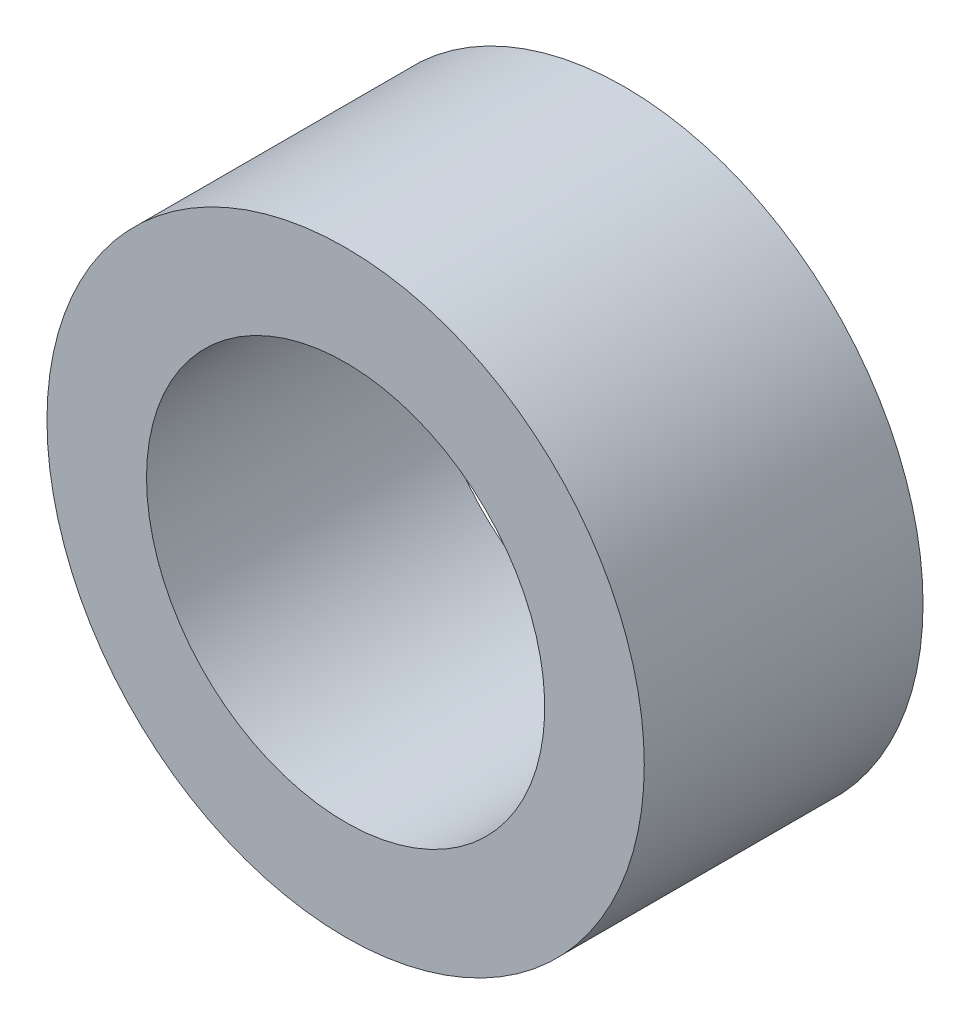
ISO-10303-21;
HEADER;
FILE_DESCRIPTION(('STEP AP214'),'2;1');
FILE_NAME('part.step','',(''),(''),'','','');
FILE_SCHEMA(('AUTOMOTIVE_DESIGN { 1 0 10303 214 1 1 1 1 }'));
ENDSEC;
DATA;
#1=APPLICATION_CONTEXT('core data for automotive mechanical design processes');
#2=APPLICATION_PROTOCOL_DEFINITION('international standard','automotive_design',2000,#1);
#3=PRODUCT_CONTEXT('',#1,'mechanical');
#4=PRODUCT('Part','Part','',(#3));
#5=PRODUCT_RELATED_PRODUCT_CATEGORY('part','',(#4));
#6=PRODUCT_DEFINITION_FORMATION('','',#4);
#7=PRODUCT_DEFINITION_CONTEXT('part definition',#1,'design');
#8=PRODUCT_DEFINITION('design','',#6,#7);
#9=PRODUCT_DEFINITION_SHAPE('','',#8);
#10=(LENGTH_UNIT() NAMED_UNIT(*) SI_UNIT(.MILLI.,.METRE.));
#11=(NAMED_UNIT(*) PLANE_ANGLE_UNIT() SI_UNIT($,.RADIAN.));
#12=(NAMED_UNIT(*) SI_UNIT($,.STERADIAN.) SOLID_ANGLE_UNIT());
#13=UNCERTAINTY_MEASURE_WITH_UNIT(LENGTH_MEASURE(1.E-05),#10,'distance_accuracy_value','');
#14=(GEOMETRIC_REPRESENTATION_CONTEXT(3) GLOBAL_UNCERTAINTY_ASSIGNED_CONTEXT((#13)) GLOBAL_UNIT_ASSIGNED_CONTEXT((#10,
#11,#12)) REPRESENTATION_CONTEXT('',''));
#15=CARTESIAN_POINT('',(0.,0.,0.));
#16=DIRECTION('',(0.,0.,1.));
#17=DIRECTION('',(1.,0.,0.));
#18=AXIS2_PLACEMENT_3D('',#15,#16,#17);
#19=CARTESIAN_POINT('',(2.4980018054066E-13,3.99680288865056E-12,13.9999999999989));
#20=DIRECTION('',(0.,0.,0.999999999999998));
#21=DIRECTION('',(1.,0.,0.));
#22=AXIS2_PLACEMENT_3D('',#19,#20,#21);
#23=PLANE('',#22);
#24=CARTESIAN_POINT('',(2.4980018054066E-13,3.99680288865056E-12,13.9999999999989));
#25=DIRECTION('',(0.,0.,0.999999999999998));
#26=DIRECTION('',(1.,0.,0.));
#27=AXIS2_PLACEMENT_3D('',#24,#25,#26);
#28=CIRCLE('',#27,30.);
#29=CARTESIAN_POINT('',(-29.9999999999997,3.94309584983432E-12,13.9999999999989));
#30=VERTEX_POINT('',#29);
#31=EDGE_CURVE('E12',#30,#30,#28,.T.);
#32=ORIENTED_EDGE('',*,*,#31,.T.);
#33=EDGE_LOOP('',(#32));
#34=FACE_BOUND('',#33,.T.);
#35=CARTESIAN_POINT('',(2.4980018054066E-13,3.99680288865056E-12,13.9999999999989));
#36=DIRECTION('',(0.,0.,0.999999999999998));
#37=DIRECTION('',(1.,0.,0.));
#38=AXIS2_PLACEMENT_3D('',#35,#36,#37);
#39=CIRCLE('',#38,20.);
#40=CARTESIAN_POINT('',(-19.9999999999998,3.9609981961064E-12,13.9999999999989));
#41=VERTEX_POINT('',#40);
#42=EDGE_CURVE('E56',#41,#41,#39,.T.);
#43=ORIENTED_EDGE('',*,*,#42,.F.);
#44=EDGE_LOOP('',(#43));
#45=FACE_BOUND('',#44,.T.);
#46=ADVANCED_FACE('F42',(#34,#45),#23,.T.);
#47=CARTESIAN_POINT('',(2.77555756156289E-13,2.66453525910038E-12,-14.0000000000002));
#48=DIRECTION('',(0.,0.,0.999999999999998));
#49=DIRECTION('',(1.,0.,0.));
#50=AXIS2_PLACEMENT_3D('',#47,#48,#49);
#51=PLANE('',#50);
#52=CARTESIAN_POINT('',(2.77555756156289E-13,2.66453525910038E-12,-14.0000000000002));
#53=DIRECTION('',(0.,0.,0.999999999999998));
#54=DIRECTION('',(1.,0.,0.));
#55=AXIS2_PLACEMENT_3D('',#52,#53,#54);
#56=CIRCLE('',#55,30.);
#57=CARTESIAN_POINT('',(-29.9999999999997,3.94960453231619E-12,-14.0000000000002));
#58=VERTEX_POINT('',#57);
#59=EDGE_CURVE('E46',#58,#58,#56,.T.);
#60=ORIENTED_EDGE('',*,*,#59,.F.);
#61=EDGE_LOOP('',(#60));
#62=FACE_BOUND('',#61,.T.);
#63=CARTESIAN_POINT('',(2.77555756156289E-13,2.66453525910038E-12,-14.0000000000002));
#64=DIRECTION('',(0.,0.,0.999999999999998));
#65=DIRECTION('',(1.,0.,0.));
#66=AXIS2_PLACEMENT_3D('',#63,#64,#65);
#67=CIRCLE('',#66,20.);
#68=CARTESIAN_POINT('',(-19.9999999999998,3.96750687858827E-12,-14.0000000000002));
#69=VERTEX_POINT('',#68);
#70=EDGE_CURVE('E58',#69,#69,#67,.T.);
#71=ORIENTED_EDGE('',*,*,#70,.T.);
#72=EDGE_LOOP('',(#71));
#73=FACE_BOUND('',#72,.T.);
#74=ADVANCED_FACE('F71',(#62,#73),#51,.F.);
#75=CARTESIAN_POINT('',(2.4980018054066E-13,3.99680288865056E-12,13.9999999999989));
#76=DIRECTION('',(0.,0.,-0.999999999999998));
#77=DIRECTION('',(-1.,0.,0.));
#78=AXIS2_PLACEMENT_3D('',#75,#76,#77);
#79=CYLINDRICAL_SURFACE('',#78,30.);
#80=CARTESIAN_POINT('',(-29.9999999999997,3.94309584983432E-12,13.9999999999989));
#81=CARTESIAN_POINT('',(-29.9999999999997,3.94316364861017E-12,13.7083333333322));
#82=CARTESIAN_POINT('',(-29.9999999999997,3.94323144738603E-12,13.4166666666656));
#83=CARTESIAN_POINT('',(-29.9999999999997,3.94336704493773E-12,12.8333333333323));
#84=CARTESIAN_POINT('',(-29.9999999999997,3.94343484371359E-12,12.5416666666656));
#85=CARTESIAN_POINT('',(-29.9999999999997,3.94357044126529E-12,11.9583333333323));
#86=CARTESIAN_POINT('',(-29.9999999999997,3.94363824004114E-12,11.6666666666656));
#87=CARTESIAN_POINT('',(-29.9999999999997,3.94377383759285E-12,11.0833333333323));
#88=CARTESIAN_POINT('',(-29.9999999999997,3.9438416363687E-12,10.7916666666657));
#89=CARTESIAN_POINT('',(-29.9999999999997,3.94397723392041E-12,10.2083333333324));
#90=CARTESIAN_POINT('',(-29.9999999999997,3.94404503269626E-12,9.91666666666569));
#91=CARTESIAN_POINT('',(-29.9999999999997,3.94418063024797E-12,9.33333333333238));
#92=CARTESIAN_POINT('',(-29.9999999999997,3.94424842902382E-12,9.04166666666572));
#93=CARTESIAN_POINT('',(-29.9999999999997,3.94438402657552E-12,8.4583333333324));
#94=CARTESIAN_POINT('',(-29.9999999999997,3.94445182535138E-12,8.16666666666575));
#95=CARTESIAN_POINT('',(-29.9999999999997,3.94458742290308E-12,7.58333333333243));
#96=CARTESIAN_POINT('',(-29.9999999999997,3.94465522167894E-12,7.29166666666577));
#97=CARTESIAN_POINT('',(-29.9999999999997,3.94479081923064E-12,6.70833333333246));
#98=CARTESIAN_POINT('',(-29.9999999999997,3.94485861800649E-12,6.4166666666658));
#99=CARTESIAN_POINT('',(-29.9999999999997,3.9449942155582E-12,5.83333333333249));
#100=CARTESIAN_POINT('',(-29.9999999999997,3.94506201433405E-12,5.54166666666583));
#101=CARTESIAN_POINT('',(-29.9999999999997,3.94519761188576E-12,4.95833333333251));
#102=CARTESIAN_POINT('',(-29.9999999999997,3.94526541066161E-12,4.66666666666586));
#103=CARTESIAN_POINT('',(-29.9999999999997,3.94540100821331E-12,4.08333333333254));
#104=CARTESIAN_POINT('',(-29.9999999999997,3.94546880698917E-12,3.79166666666588));
#105=CARTESIAN_POINT('',(-29.9999999999997,3.94560440454087E-12,3.20833333333257));
#106=CARTESIAN_POINT('',(-29.9999999999997,3.94567220331673E-12,2.91666666666591));
#107=CARTESIAN_POINT('',(-29.9999999999997,3.94580780086843E-12,2.33333333333259));
#108=CARTESIAN_POINT('',(-29.9999999999997,3.94587559964428E-12,2.04166666666593));
#109=CARTESIAN_POINT('',(-29.9999999999997,3.94601119719599E-12,1.45833333333262));
#110=CARTESIAN_POINT('',(-29.9999999999997,3.94607899597184E-12,1.16666666666596));
#111=CARTESIAN_POINT('',(-29.9999999999997,3.94621459352355E-12,0.583333333332647));
#112=CARTESIAN_POINT('',(-29.9999999999997,3.9462823922994E-12,0.29166666666599));
#113=CARTESIAN_POINT('',(-29.9999999999997,3.94641798985111E-12,-0.291666666667325));
#114=CARTESIAN_POINT('',(-29.9999999999997,3.94648578862696E-12,-0.583333333333983));
#115=CARTESIAN_POINT('',(-29.9999999999997,3.94662138617866E-12,-1.1666666666673));
#116=CARTESIAN_POINT('',(-29.9999999999997,3.94668918495452E-12,-1.45833333333396));
#117=CARTESIAN_POINT('',(-29.9999999999997,3.94682478250622E-12,-2.04166666666727));
#118=CARTESIAN_POINT('',(-29.9999999999997,3.94689258128208E-12,-2.33333333333393));
#119=CARTESIAN_POINT('',(-29.9999999999997,3.94702817883378E-12,-2.91666666666724));
#120=CARTESIAN_POINT('',(-29.9999999999997,3.94709597760963E-12,-3.2083333333339));
#121=CARTESIAN_POINT('',(-29.9999999999997,3.94723157516134E-12,-3.79166666666722));
#122=CARTESIAN_POINT('',(-29.9999999999997,3.94729937393719E-12,-4.08333333333387));
#123=CARTESIAN_POINT('',(-29.9999999999997,3.9474349714889E-12,-4.66666666666719));
#124=CARTESIAN_POINT('',(-29.9999999999997,3.94750277026475E-12,-4.95833333333385));
#125=CARTESIAN_POINT('',(-29.9999999999997,3.94763836781646E-12,-5.54166666666716));
#126=CARTESIAN_POINT('',(-29.9999999999997,3.94770616659231E-12,-5.83333333333382));
#127=CARTESIAN_POINT('',(-29.9999999999997,3.94784176414402E-12,-6.41666666666714));
#128=CARTESIAN_POINT('',(-29.9999999999997,3.94790956291987E-12,-6.70833333333379));
#129=CARTESIAN_POINT('',(-29.9999999999997,3.94804516047157E-12,-7.29166666666711));
#130=CARTESIAN_POINT('',(-29.9999999999997,3.94811295924743E-12,-7.58333333333377));
#131=CARTESIAN_POINT('',(-29.9999999999997,3.94824855679913E-12,-8.16666666666708));
#132=CARTESIAN_POINT('',(-29.9999999999997,3.94831635557498E-12,-8.45833333333374));
#133=CARTESIAN_POINT('',(-29.9999999999997,3.94845195312669E-12,-9.04166666666706));
#134=CARTESIAN_POINT('',(-29.9999999999997,3.94851975190254E-12,-9.33333333333371));
#135=CARTESIAN_POINT('',(-29.9999999999997,3.94865534945425E-12,-9.91666666666703));
#136=CARTESIAN_POINT('',(-29.9999999999997,3.9487231482301E-12,-10.2083333333337));
#137=CARTESIAN_POINT('',(-29.9999999999997,3.94885874578181E-12,-10.791666666667));
#138=CARTESIAN_POINT('',(-29.9999999999997,3.94892654455766E-12,-11.0833333333337));
#139=CARTESIAN_POINT('',(-29.9999999999997,3.94906214210936E-12,-11.666666666667));
#140=CARTESIAN_POINT('',(-29.9999999999997,3.94912994088522E-12,-11.9583333333336));
#141=CARTESIAN_POINT('',(-29.9999999999997,3.94926553843692E-12,-12.5416666666669));
#142=CARTESIAN_POINT('',(-29.9999999999997,3.94933333721278E-12,-12.8333333333336));
#143=CARTESIAN_POINT('',(-29.9999999999997,3.94946893476448E-12,-13.4166666666669));
#144=CARTESIAN_POINT('',(-29.9999999999997,3.94953673354033E-12,-13.7083333333336));
#145=CARTESIAN_POINT('',(-29.9999999999997,3.94960453231619E-12,-14.0000000000002));
#146=B_SPLINE_CURVE_WITH_KNOTS('',3,(#80,#81,#82,#83,#84,#85,#86,#87,#88,#89,#90,#91,#92,#93,
#94,#95,#96,#97,#98,#99,#100,#101,#102,#103,#104,#105,#106,#107,#108,#109,#110,#111,#112,#113,
#114,#115,#116,#117,#118,#119,#120,#121,#122,#123,#124,#125,#126,#127,#128,#129,#130,#131,#132,
#133,#134,#135,#136,#137,#138,#139,#140,#141,#142,#143,#144,#145),.UNSPECIFIED.,.F.,.F.,(4,2,2,
2,2,2,2,2,2,2,2,2,2,2,2,2,2,2,2,2,2,2,2,2,2,2,2,2,2,2,2,2,4),(0.,0.874999999999971,
1.74999999999994,2.62499999999992,3.49999999999989,4.37499999999986,5.24999999999984,
6.12499999999981,6.99999999999978,7.87499999999976,8.74999999999973,9.6249999999997,
10.4999999999997,11.3749999999997,12.2499999999996,13.1249999999996,13.9999999999996,
14.8749999999995,15.7499999999995,16.6249999999995,17.4999999999995,18.3749999999994,
19.2499999999994,20.1249999999994,20.9999999999994,21.8749999999993,22.7499999999993,
23.6249999999993,24.4999999999992,25.3749999999992,26.2499999999992,27.1249999999992,
27.9999999999991),.UNSPECIFIED.);
#147=EDGE_CURVE('BSEAM44',#30,#58,#146,.T.);
#148=ORIENTED_EDGE('',*,*,#31,.F.);
#149=ORIENTED_EDGE('',*,*,#59,.T.);
#150=ORIENTED_EDGE('',*,*,#147,.T.);
#151=ORIENTED_EDGE('',*,*,#147,.F.);
#152=EDGE_LOOP('',(#148,#150,#149,#151));
#153=FACE_BOUND('',#152,.T.);
#154=ADVANCED_FACE('F44',(#153),#79,.T.);
#155=CARTESIAN_POINT('',(2.4980018054066E-13,3.99680288865056E-12,13.9999999999989));
#156=DIRECTION('',(0.,0.,-0.999999999999998));
#157=DIRECTION('',(-1.,0.,0.));
#158=AXIS2_PLACEMENT_3D('',#155,#156,#157);
#159=CYLINDRICAL_SURFACE('',#158,20.);
#160=CARTESIAN_POINT('',(-19.9999999999998,3.9609981961064E-12,13.9999999999989));
#161=CARTESIAN_POINT('',(-19.9999999999998,3.96106599488225E-12,13.7083333333322));
#162=CARTESIAN_POINT('',(-19.9999999999998,3.96113379365811E-12,13.4166666666656));
#163=CARTESIAN_POINT('',(-19.9999999999998,3.96126939120981E-12,12.8333333333323));
#164=CARTESIAN_POINT('',(-19.9999999999998,3.96133718998567E-12,12.5416666666656));
#165=CARTESIAN_POINT('',(-19.9999999999998,3.96147278753737E-12,11.9583333333323));
#166=CARTESIAN_POINT('',(-19.9999999999998,3.96154058631322E-12,11.6666666666656));
#167=CARTESIAN_POINT('',(-19.9999999999998,3.96167618386493E-12,11.0833333333323));
#168=CARTESIAN_POINT('',(-19.9999999999998,3.96174398264078E-12,10.7916666666657));
#169=CARTESIAN_POINT('',(-19.9999999999998,3.96187958019249E-12,10.2083333333324));
#170=CARTESIAN_POINT('',(-19.9999999999998,3.96194737896834E-12,9.91666666666569));
#171=CARTESIAN_POINT('',(-19.9999999999998,3.96208297652005E-12,9.33333333333238));
#172=CARTESIAN_POINT('',(-19.9999999999998,3.9621507752959E-12,9.04166666666572));
#173=CARTESIAN_POINT('',(-19.9999999999998,3.9622863728476E-12,8.4583333333324));
#174=CARTESIAN_POINT('',(-19.9999999999998,3.96235417162346E-12,8.16666666666575));
#175=CARTESIAN_POINT('',(-19.9999999999998,3.96248976917516E-12,7.58333333333243));
#176=CARTESIAN_POINT('',(-19.9999999999998,3.96255756795102E-12,7.29166666666577));
#177=CARTESIAN_POINT('',(-19.9999999999998,3.96269316550272E-12,6.70833333333246));
#178=CARTESIAN_POINT('',(-19.9999999999998,3.96276096427857E-12,6.4166666666658));
#179=CARTESIAN_POINT('',(-19.9999999999998,3.96289656183028E-12,5.83333333333249));
#180=CARTESIAN_POINT('',(-19.9999999999998,3.96296436060613E-12,5.54166666666583));
#181=CARTESIAN_POINT('',(-19.9999999999998,3.96309995815784E-12,4.95833333333251));
#182=CARTESIAN_POINT('',(-19.9999999999998,3.96316775693369E-12,4.66666666666586));
#183=CARTESIAN_POINT('',(-19.9999999999998,3.9633033544854E-12,4.08333333333254));
#184=CARTESIAN_POINT('',(-19.9999999999998,3.96337115326125E-12,3.79166666666588));
#185=CARTESIAN_POINT('',(-19.9999999999998,3.96350675081296E-12,3.20833333333257));
#186=CARTESIAN_POINT('',(-19.9999999999998,3.96357454958881E-12,2.91666666666591));
#187=CARTESIAN_POINT('',(-19.9999999999998,3.96371014714051E-12,2.33333333333259));
#188=CARTESIAN_POINT('',(-19.9999999999998,3.96377794591637E-12,2.04166666666594));
#189=CARTESIAN_POINT('',(-19.9999999999998,3.96391354346807E-12,1.45833333333262));
#190=CARTESIAN_POINT('',(-19.9999999999998,3.96398134224392E-12,1.16666666666596));
#191=CARTESIAN_POINT('',(-19.9999999999998,3.96411693979563E-12,0.583333333332649));
#192=CARTESIAN_POINT('',(-19.9999999999998,3.96418473857148E-12,0.291666666665992));
#193=CARTESIAN_POINT('',(-19.9999999999998,3.96432033612319E-12,-0.291666666667324));
#194=CARTESIAN_POINT('',(-19.9999999999998,3.96438813489904E-12,-0.583333333333981));
#195=CARTESIAN_POINT('',(-19.9999999999998,3.96452373245075E-12,-1.1666666666673));
#196=CARTESIAN_POINT('',(-19.9999999999998,3.9645915312266E-12,-1.45833333333395));
#197=CARTESIAN_POINT('',(-19.9999999999998,3.9647271287783E-12,-2.04166666666727));
#198=CARTESIAN_POINT('',(-19.9999999999998,3.96479492755416E-12,-2.33333333333393));
#199=CARTESIAN_POINT('',(-19.9999999999998,3.96493052510586E-12,-2.91666666666724));
#200=CARTESIAN_POINT('',(-19.9999999999998,3.96499832388171E-12,-3.2083333333339));
#201=CARTESIAN_POINT('',(-19.9999999999998,3.96513392143342E-12,-3.79166666666722));
#202=CARTESIAN_POINT('',(-19.9999999999998,3.96520172020927E-12,-4.08333333333387));
#203=CARTESIAN_POINT('',(-19.9999999999998,3.96533731776098E-12,-4.66666666666719));
#204=CARTESIAN_POINT('',(-19.9999999999998,3.96540511653683E-12,-4.95833333333385));
#205=CARTESIAN_POINT('',(-19.9999999999998,3.96554071408854E-12,-5.54166666666716));
#206=CARTESIAN_POINT('',(-19.9999999999998,3.96560851286439E-12,-5.83333333333382));
#207=CARTESIAN_POINT('',(-19.9999999999998,3.9657441104161E-12,-6.41666666666714));
#208=CARTESIAN_POINT('',(-19.9999999999998,3.96581190919195E-12,-6.70833333333379));
#209=CARTESIAN_POINT('',(-19.9999999999998,3.96594750674365E-12,-7.29166666666711));
#210=CARTESIAN_POINT('',(-19.9999999999998,3.96601530551951E-12,-7.58333333333377));
#211=CARTESIAN_POINT('',(-19.9999999999998,3.96615090307121E-12,-8.16666666666708));
#212=CARTESIAN_POINT('',(-19.9999999999998,3.96621870184707E-12,-8.45833333333374));
#213=CARTESIAN_POINT('',(-19.9999999999998,3.96635429939877E-12,-9.04166666666705));
#214=CARTESIAN_POINT('',(-19.9999999999998,3.96642209817462E-12,-9.33333333333371));
#215=CARTESIAN_POINT('',(-19.9999999999998,3.96655769572633E-12,-9.91666666666703));
#216=CARTESIAN_POINT('',(-19.9999999999998,3.96662549450218E-12,-10.2083333333337));
#217=CARTESIAN_POINT('',(-19.9999999999998,3.96676109205389E-12,-10.791666666667));
#218=CARTESIAN_POINT('',(-19.9999999999998,3.96682889082974E-12,-11.0833333333337));
#219=CARTESIAN_POINT('',(-19.9999999999998,3.96696448838145E-12,-11.666666666667));
#220=CARTESIAN_POINT('',(-19.9999999999998,3.9670322871573E-12,-11.9583333333336));
#221=CARTESIAN_POINT('',(-19.9999999999998,3.967167884709E-12,-12.5416666666669));
#222=CARTESIAN_POINT('',(-19.9999999999998,3.96723568348486E-12,-12.8333333333336));
#223=CARTESIAN_POINT('',(-19.9999999999998,3.96737128103656E-12,-13.4166666666669));
#224=CARTESIAN_POINT('',(-19.9999999999998,3.96743907981241E-12,-13.7083333333336));
#225=CARTESIAN_POINT('',(-19.9999999999998,3.96750687858827E-12,-14.0000000000002));
#226=B_SPLINE_CURVE_WITH_KNOTS('',3,(#160,#161,#162,#163,#164,#165,#166,#167,#168,#169,#170,
#171,#172,#173,#174,#175,#176,#177,#178,#179,#180,#181,#182,#183,#184,#185,#186,#187,#188,#189,
#190,#191,#192,#193,#194,#195,#196,#197,#198,#199,#200,#201,#202,#203,#204,#205,#206,#207,#208,
#209,#210,#211,#212,#213,#214,#215,#216,#217,#218,#219,#220,#221,#222,#223,#224,#225),
.UNSPECIFIED.,.F.,.F.,(4,2,2,2,2,2,2,2,2,2,2,2,2,2,2,2,2,2,2,2,2,2,2,2,2,2,2,2,2,2,2,2,4),(0.,
0.874999999999973,1.74999999999995,2.62499999999992,3.49999999999989,4.37499999999986,
5.24999999999984,6.12499999999981,6.99999999999979,7.87499999999976,8.74999999999973,
9.6249999999997,10.4999999999997,11.3749999999997,12.2499999999996,13.1249999999996,
13.9999999999996,14.8749999999995,15.7499999999995,16.6249999999995,17.4999999999995,
18.3749999999994,19.2499999999994,20.1249999999994,20.9999999999994,21.8749999999993,
22.7499999999993,23.6249999999993,24.4999999999992,25.3749999999992,26.2499999999992,
27.1249999999992,27.9999999999991),.UNSPECIFIED.);
#227=EDGE_CURVE('BSEAM67',#41,#69,#226,.T.);
#228=ORIENTED_EDGE('',*,*,#42,.T.);
#229=ORIENTED_EDGE('',*,*,#70,.F.);
#230=ORIENTED_EDGE('',*,*,#227,.T.);
#231=ORIENTED_EDGE('',*,*,#227,.F.);
#232=EDGE_LOOP('',(#228,#230,#229,#231));
#233=FACE_BOUND('',#232,.T.);
#234=ADVANCED_FACE('F67',(#233),#159,.F.);
#235=CLOSED_SHELL('',(#46,#74,#154,#234));
#236=MANIFOLD_SOLID_BREP('B2',#235);
#237=ADVANCED_BREP_SHAPE_REPRESENTATION('',(#18,#236),#14);
#238=SHAPE_DEFINITION_REPRESENTATION(#9,#237);
ENDSEC;
END-ISO-10303-21;
